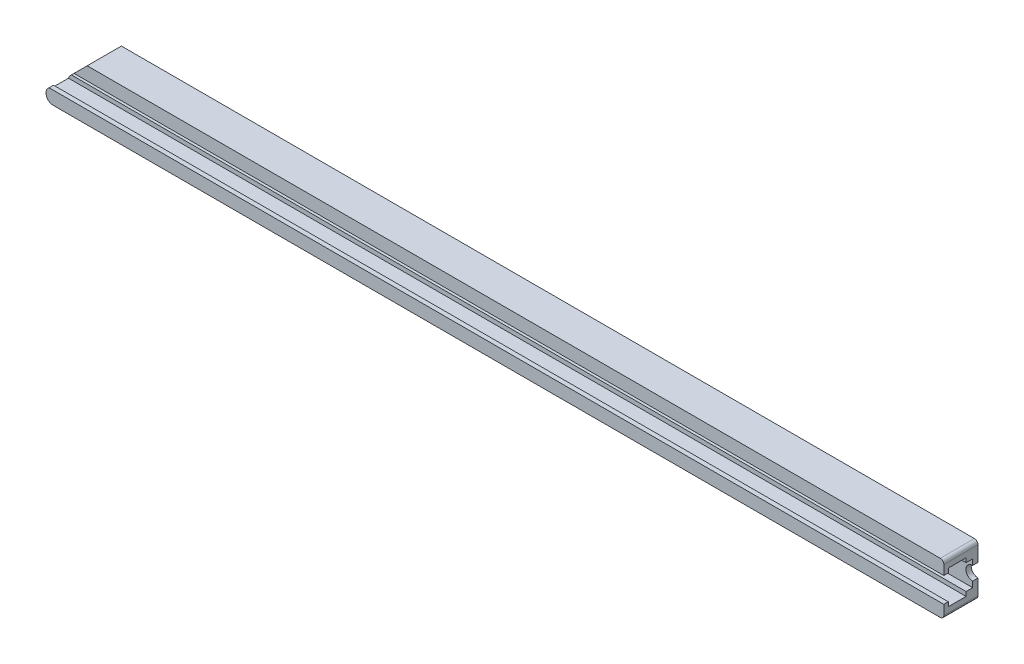
ISO-10303-21;
HEADER;
FILE_DESCRIPTION(('STEP AP214'),'2;1');
FILE_NAME('part.step','',(''),(''),'','','');
FILE_SCHEMA(('AUTOMOTIVE_DESIGN { 1 0 10303 214 1 1 1 1 }'));
ENDSEC;
DATA;
#1=APPLICATION_CONTEXT('core data for automotive mechanical design processes');
#2=APPLICATION_PROTOCOL_DEFINITION('international standard','automotive_design',2000,#1);
#3=PRODUCT_CONTEXT('',#1,'mechanical');
#4=PRODUCT('Part','Part','',(#3));
#5=PRODUCT_RELATED_PRODUCT_CATEGORY('part','',(#4));
#6=PRODUCT_DEFINITION_FORMATION('','',#4);
#7=PRODUCT_DEFINITION_CONTEXT('part definition',#1,'design');
#8=PRODUCT_DEFINITION('design','',#6,#7);
#9=PRODUCT_DEFINITION_SHAPE('','',#8);
#10=(LENGTH_UNIT() NAMED_UNIT(*) SI_UNIT(.MILLI.,.METRE.));
#11=(NAMED_UNIT(*) PLANE_ANGLE_UNIT() SI_UNIT($,.RADIAN.));
#12=(NAMED_UNIT(*) SI_UNIT($,.STERADIAN.) SOLID_ANGLE_UNIT());
#13=UNCERTAINTY_MEASURE_WITH_UNIT(LENGTH_MEASURE(1.E-05),#10,'distance_accuracy_value','');
#14=(GEOMETRIC_REPRESENTATION_CONTEXT(3) GLOBAL_UNCERTAINTY_ASSIGNED_CONTEXT((#13)) GLOBAL_UNIT_ASSIGNED_CONTEXT((#10,
#11,#12)) REPRESENTATION_CONTEXT('',''));
#15=CARTESIAN_POINT('',(0.,0.,0.));
#16=DIRECTION('',(0.,0.,1.));
#17=DIRECTION('',(1.,0.,0.));
#18=AXIS2_PLACEMENT_3D('',#15,#16,#17);
#19=CARTESIAN_POINT('',(-209.55,-9.14400000000005,0.));
#20=DIRECTION('',(0.707106781186551,-0.707106781186544,0.));
#21=DIRECTION('',(0.707106781186544,0.707106781186551,0.));
#22=AXIS2_PLACEMENT_3D('',#19,#20,#21);
#23=PLANE('',#22);
#24=DIRECTION('',(0.707106781186544,0.707106781186551,0.));
#25=VECTOR('',#24,1.);
#26=CARTESIAN_POINT('',(-209.55,-9.14400000000005,0.));
#27=LINE('',#26,#25);
#28=CARTESIAN_POINT('',(-205.213948775786,-4.80794877578618,0.));
#29=VERTEX_POINT('',#28);
#30=CARTESIAN_POINT('',(-191.262,9.144,0.));
#31=VERTEX_POINT('',#30);
#32=EDGE_CURVE('E392',#29,#31,#27,.T.);
#33=ORIENTED_EDGE('',*,*,#32,.F.);
#34=DIRECTION('',(0.,0.,1.));
#35=VECTOR('',#34,1.);
#36=CARTESIAN_POINT('',(-205.213948775786,-4.80794877578618,0.));
#37=LINE('',#36,#35);
#38=CARTESIAN_POINT('',(-205.213948775786,-4.80794877578622,4.2545));
#39=VERTEX_POINT('',#38);
#40=EDGE_CURVE('E292',#29,#39,#37,.T.);
#41=ORIENTED_EDGE('',*,*,#40,.T.);
#42=DIRECTION('',(-0.707106781186544,-0.707106781186551,0.));
#43=VECTOR('',#42,1.);
#44=CARTESIAN_POINT('',(11.8744999999978,212.2805,4.25450000000012));
#45=LINE('',#44,#43);
#46=CARTESIAN_POINT('',(-204.851,-4.445,4.2545));
#47=VERTEX_POINT('',#46);
#48=EDGE_CURVE('E412',#47,#39,#45,.T.);
#49=ORIENTED_EDGE('',*,*,#48,.F.);
#50=DIRECTION('',(0.,0.,1.));
#51=VECTOR('',#50,1.);
#52=CARTESIAN_POINT('',(-204.851,-4.445,1.90499999999968));
#53=LINE('',#52,#51);
#54=CARTESIAN_POINT('',(-204.851,-4.445,1.905));
#55=VERTEX_POINT('',#54);
#56=EDGE_CURVE('E416',#55,#47,#53,.T.);
#57=ORIENTED_EDGE('',*,*,#56,.F.);
#58=DIRECTION('',(-0.707106781186544,-0.707106781186551,0.));
#59=VECTOR('',#58,1.);
#60=CARTESIAN_POINT('',(16.3194999999977,216.7255,1.90500000000003));
#61=LINE('',#60,#59);
#62=CARTESIAN_POINT('',(-195.961,4.44499999999998,1.905));
#63=VERTEX_POINT('',#62);
#64=EDGE_CURVE('E420',#63,#55,#61,.T.);
#65=ORIENTED_EDGE('',*,*,#64,.F.);
#66=DIRECTION('',(0.,0.,-1.));
#67=VECTOR('',#66,1.);
#68=CARTESIAN_POINT('',(-195.961,4.445,4.2545));
#69=LINE('',#68,#67);
#70=CARTESIAN_POINT('',(-195.961,4.445,4.2545));
#71=VERTEX_POINT('',#70);
#72=EDGE_CURVE('E424',#71,#63,#69,.T.);
#73=ORIENTED_EDGE('',*,*,#72,.F.);
#74=DIRECTION('',(-0.707106781186544,-0.707106781186551,0.));
#75=VECTOR('',#74,1.);
#76=CARTESIAN_POINT('',(17.0814999999978,217.4875,4.2545));
#77=LINE('',#76,#75);
#78=CARTESIAN_POINT('',(-194.437,5.96899999999997,4.2545));
#79=VERTEX_POINT('',#78);
#80=EDGE_CURVE('E428',#79,#71,#77,.T.);
#81=ORIENTED_EDGE('',*,*,#80,.F.);
#82=DIRECTION('',(0.,0.,-1.));
#83=VECTOR('',#82,1.);
#84=CARTESIAN_POINT('',(-194.437,5.969,10.6044999999999));
#85=LINE('',#84,#83);
#86=CARTESIAN_POINT('',(-194.437,5.969,10.6045));
#87=VERTEX_POINT('',#86);
#88=EDGE_CURVE('E432',#87,#79,#85,.T.);
#89=ORIENTED_EDGE('',*,*,#88,.F.);
#90=DIRECTION('',(0.707106781186544,0.707106781186551,0.));
#91=VECTOR('',#90,1.);
#92=CARTESIAN_POINT('',(16.3194999999977,216.7255,10.6045));
#93=LINE('',#92,#91);
#94=CARTESIAN_POINT('',(-195.961,4.445,10.6045));
#95=VERTEX_POINT('',#94);
#96=EDGE_CURVE('E436',#95,#87,#93,.T.);
#97=ORIENTED_EDGE('',*,*,#96,.F.);
#98=DIRECTION('',(0.,0.,-1.));
#99=VECTOR('',#98,1.);
#100=CARTESIAN_POINT('',(-195.961,4.445,12.192));
#101=LINE('',#100,#99);
#102=CARTESIAN_POINT('',(-195.961,4.445,12.192));
#103=VERTEX_POINT('',#102);
#104=EDGE_CURVE('E440',#103,#95,#101,.T.);
#105=ORIENTED_EDGE('',*,*,#104,.F.);
#106=DIRECTION('',(0.707106781186544,0.707106781186551,0.));
#107=VECTOR('',#106,1.);
#108=CARTESIAN_POINT('',(-209.55,-9.14400000000005,12.192));
#109=LINE('',#108,#107);
#110=CARTESIAN_POINT('',(-191.262,9.144,12.192));
#111=VERTEX_POINT('',#110);
#112=EDGE_CURVE('E391',#103,#111,#109,.T.);
#113=ORIENTED_EDGE('',*,*,#112,.T.);
#114=DIRECTION('',(0.,0.,1.));
#115=VECTOR('',#114,1.);
#116=CARTESIAN_POINT('',(-191.262,9.144,0.));
#117=LINE('',#116,#115);
#118=EDGE_CURVE('E396',#31,#111,#117,.T.);
#119=ORIENTED_EDGE('',*,*,#118,.F.);
#120=EDGE_LOOP('',(#33,#41,#49,#57,#65,#73,#81,#89,#97,#105,#113,#119));
#121=FACE_BOUND('',#120,.T.);
#122=ADVANCED_FACE('F45',(#121),#23,.F.);
#123=CARTESIAN_POINT('',(228.6,-9.144,0.));
#124=DIRECTION('',(0.,0.,1.));
#125=DIRECTION('',(0.,-1.,0.));
#126=AXIS2_PLACEMENT_3D('',#123,#124,#125);
#127=PLANE('',#126);
#128=DIRECTION('',(0.,-1.,0.));
#129=VECTOR('',#128,1.);
#130=CARTESIAN_POINT('',(114.3,9.144,0.));
#131=LINE('',#130,#129);
#132=CARTESIAN_POINT('',(114.3,-2.413,0.));
#133=VERTEX_POINT('',#132);
#134=CARTESIAN_POINT('',(114.3,-7.874,0.));
#135=VERTEX_POINT('',#134);
#136=EDGE_CURVE('E206',#133,#135,#131,.T.);
#137=ORIENTED_EDGE('',*,*,#136,.T.);
#138=CARTESIAN_POINT('',(113.03,-7.874,0.));
#139=DIRECTION('',(0.,0.,1.));
#140=DIRECTION('',(0.,-1.,0.));
#141=AXIS2_PLACEMENT_3D('',#138,#139,#140);
#142=CIRCLE('',#141,1.27);
#143=CARTESIAN_POINT('',(113.03,-9.144,0.));
#144=VERTEX_POINT('',#143);
#145=EDGE_CURVE('E331',#135,#144,#142,.F.);
#146=ORIENTED_EDGE('',*,*,#145,.T.);
#147=DIRECTION('',(-1.,0.,0.));
#148=VECTOR('',#147,1.);
#149=CARTESIAN_POINT('',(228.6,-9.144,0.));
#150=LINE('',#149,#148);
#151=CARTESIAN_POINT('',(-203.417897551572,-9.144,0.));
#152=VERTEX_POINT('',#151);
#153=EDGE_CURVE('E241',#144,#152,#150,.T.);
#154=ORIENTED_EDGE('',*,*,#153,.T.);
#155=CARTESIAN_POINT('',(-203.417897551572,-6.604,0.));
#156=DIRECTION('',(0.,0.,1.));
#157=DIRECTION('',(0.,-1.,0.));
#158=AXIS2_PLACEMENT_3D('',#155,#156,#157);
#159=CIRCLE('',#158,2.54);
#160=EDGE_CURVE('E217',#152,#29,#159,.F.);
#161=ORIENTED_EDGE('',*,*,#160,.T.);
#162=ORIENTED_EDGE('',*,*,#32,.T.);
#163=DIRECTION('',(-1.,0.,0.));
#164=VECTOR('',#163,1.);
#165=CARTESIAN_POINT('',(228.6,9.144,0.));
#166=LINE('',#165,#164);
#167=CARTESIAN_POINT('',(113.03,9.144,0.));
#168=VERTEX_POINT('',#167);
#169=EDGE_CURVE('E286',#168,#31,#166,.T.);
#170=ORIENTED_EDGE('',*,*,#169,.F.);
#171=CARTESIAN_POINT('',(113.03,7.874,0.));
#172=DIRECTION('',(0.,0.,1.));
#173=DIRECTION('',(0.,-1.,0.));
#174=AXIS2_PLACEMENT_3D('',#171,#172,#173);
#175=CIRCLE('',#174,1.27);
#176=CARTESIAN_POINT('',(114.3,7.874,0.));
#177=VERTEX_POINT('',#176);
#178=EDGE_CURVE('E202',#168,#177,#175,.F.);
#179=ORIENTED_EDGE('',*,*,#178,.T.);
#180=CARTESIAN_POINT('',(114.3,2.413,0.));
#181=VERTEX_POINT('',#180);
#182=EDGE_CURVE('E193',#177,#181,#131,.T.);
#183=ORIENTED_EDGE('',*,*,#182,.T.);
#184=CARTESIAN_POINT('',(114.3,0.,0.));
#185=DIRECTION('',(0.,0.,1.));
#186=DIRECTION('',(0.,-1.,0.));
#187=AXIS2_PLACEMENT_3D('',#184,#185,#186);
#188=CIRCLE('',#187,2.413);
#189=EDGE_CURVE('E199',#133,#181,#188,.F.);
#190=ORIENTED_EDGE('',*,*,#189,.F.);
#191=EDGE_LOOP('',(#137,#146,#154,#161,#162,#170,#179,#183,#190));
#192=FACE_BOUND('',#191,.T.);
#193=CARTESIAN_POINT('',(38.1,0.,0.));
#194=DIRECTION('',(0.,0.,1.));
#195=DIRECTION('',(0.,-1.,0.));
#196=AXIS2_PLACEMENT_3D('',#193,#194,#195);
#197=CIRCLE('',#196,2.413);
#198=CARTESIAN_POINT('',(38.1,-2.413,0.));
#199=VERTEX_POINT('',#198);
#200=EDGE_CURVE('E237',#199,#199,#197,.F.);
#201=ORIENTED_EDGE('',*,*,#200,.F.);
#202=EDGE_LOOP('',(#201));
#203=FACE_BOUND('',#202,.T.);
#204=CARTESIAN_POINT('',(-114.3,0.,0.));
#205=DIRECTION('',(0.,0.,-1.));
#206=DIRECTION('',(0.,-1.,0.));
#207=AXIS2_PLACEMENT_3D('',#204,#205,#206);
#208=CIRCLE('',#207,2.413);
#209=CARTESIAN_POINT('',(-114.3,-2.413,0.));
#210=VERTEX_POINT('',#209);
#211=EDGE_CURVE('E444',#210,#210,#208,.F.);
#212=ORIENTED_EDGE('',*,*,#211,.T.);
#213=EDGE_LOOP('',(#212));
#214=FACE_BOUND('',#213,.T.);
#215=CARTESIAN_POINT('',(-38.1,0.,0.));
#216=DIRECTION('',(0.,0.,-1.));
#217=DIRECTION('',(0.,-1.,0.));
#218=AXIS2_PLACEMENT_3D('',#215,#216,#217);
#219=CIRCLE('',#218,2.413);
#220=CARTESIAN_POINT('',(-38.1,-2.413,0.));
#221=VERTEX_POINT('',#220);
#222=EDGE_CURVE('E456',#221,#221,#219,.F.);
#223=ORIENTED_EDGE('',*,*,#222,.T.);
#224=EDGE_LOOP('',(#223));
#225=FACE_BOUND('',#224,.T.);
#226=CARTESIAN_POINT('',(-190.5,0.,0.));
#227=DIRECTION('',(0.,0.,-1.));
#228=DIRECTION('',(0.,-1.,0.));
#229=AXIS2_PLACEMENT_3D('',#226,#227,#228);
#230=CIRCLE('',#229,2.413);
#231=CARTESIAN_POINT('',(-190.5,-2.413,0.));
#232=VERTEX_POINT('',#231);
#233=EDGE_CURVE('E230',#232,#232,#230,.F.);
#234=ORIENTED_EDGE('',*,*,#233,.T.);
#235=EDGE_LOOP('',(#234));
#236=FACE_BOUND('',#235,.T.);
#237=ADVANCED_FACE('F196',(#192,#203,#214,#225,#236),#127,.F.);
#238=CARTESIAN_POINT('',(228.6,9.144,0.));
#239=DIRECTION('',(0.,-1.,0.));
#240=DIRECTION('',(0.,0.,-1.));
#241=AXIS2_PLACEMENT_3D('',#238,#239,#240);
#242=PLANE('',#241);
#243=DIRECTION('',(-1.,0.,0.));
#244=VECTOR('',#243,1.);
#245=CARTESIAN_POINT('',(228.6,9.144,12.192));
#246=LINE('',#245,#244);
#247=CARTESIAN_POINT('',(113.03,9.144,12.192));
#248=VERTEX_POINT('',#247);
#249=EDGE_CURVE('E283',#248,#111,#246,.T.);
#250=ORIENTED_EDGE('',*,*,#249,.F.);
#251=DIRECTION('',(0.,0.,1.));
#252=VECTOR('',#251,1.);
#253=CARTESIAN_POINT('',(113.03,9.144,0.));
#254=LINE('',#253,#252);
#255=EDGE_CURVE('E12',#248,#168,#254,.F.);
#256=ORIENTED_EDGE('',*,*,#255,.T.);
#257=ORIENTED_EDGE('',*,*,#169,.T.);
#258=ORIENTED_EDGE('',*,*,#118,.T.);
#259=EDGE_LOOP('',(#250,#256,#257,#258));
#260=FACE_BOUND('',#259,.T.);
#261=ADVANCED_FACE('F497',(#260),#242,.F.);
#262=CARTESIAN_POINT('',(228.6,9.144,12.192));
#263=DIRECTION('',(0.,0.,-1.));
#264=DIRECTION('',(0.,1.,0.));
#265=AXIS2_PLACEMENT_3D('',#262,#263,#264);
#266=PLANE('',#265);
#267=DIRECTION('',(0.,-1.,0.));
#268=VECTOR('',#267,1.);
#269=CARTESIAN_POINT('',(114.3,9.144,12.192));
#270=LINE('',#269,#268);
#271=CARTESIAN_POINT('',(114.3,7.874,12.192));
#272=VERTEX_POINT('',#271);
#273=CARTESIAN_POINT('',(114.3,4.445,12.192));
#274=VERTEX_POINT('',#273);
#275=EDGE_CURVE('E337',#272,#274,#270,.T.);
#276=ORIENTED_EDGE('',*,*,#275,.F.);
#277=CARTESIAN_POINT('',(113.03,7.874,12.192));
#278=DIRECTION('',(0.,0.,-1.));
#279=DIRECTION('',(0.,1.,0.));
#280=AXIS2_PLACEMENT_3D('',#277,#278,#279);
#281=CIRCLE('',#280,1.27);
#282=EDGE_CURVE('E54',#272,#248,#281,.F.);
#283=ORIENTED_EDGE('',*,*,#282,.T.);
#284=ORIENTED_EDGE('',*,*,#249,.T.);
#285=ORIENTED_EDGE('',*,*,#112,.F.);
#286=DIRECTION('',(-1.,0.,0.));
#287=VECTOR('',#286,1.);
#288=CARTESIAN_POINT('',(228.6,4.445,12.192));
#289=LINE('',#288,#287);
#290=EDGE_CURVE('E280',#274,#103,#289,.T.);
#291=ORIENTED_EDGE('',*,*,#290,.F.);
#292=EDGE_LOOP('',(#276,#283,#284,#285,#291));
#293=FACE_BOUND('',#292,.T.);
#294=ADVANCED_FACE('F340',(#293),#266,.F.);
#295=CARTESIAN_POINT('',(228.6,4.445,12.192));
#296=DIRECTION('',(0.,1.,0.));
#297=DIRECTION('',(0.,0.,1.));
#298=AXIS2_PLACEMENT_3D('',#295,#296,#297);
#299=PLANE('',#298);
#300=DIRECTION('',(-1.,0.,0.));
#301=VECTOR('',#300,1.);
#302=CARTESIAN_POINT('',(228.6,4.445,10.6045));
#303=LINE('',#302,#301);
#304=CARTESIAN_POINT('',(114.3,4.445,10.6045));
#305=VERTEX_POINT('',#304);
#306=EDGE_CURVE('E277',#305,#95,#303,.T.);
#307=ORIENTED_EDGE('',*,*,#306,.F.);
#308=DIRECTION('',(0.,0.,1.));
#309=VECTOR('',#308,1.);
#310=CARTESIAN_POINT('',(114.3,4.445,12.192));
#311=LINE('',#310,#309);
#312=EDGE_CURVE('E368',#305,#274,#311,.T.);
#313=ORIENTED_EDGE('',*,*,#312,.T.);
#314=ORIENTED_EDGE('',*,*,#290,.T.);
#315=ORIENTED_EDGE('',*,*,#104,.T.);
#316=EDGE_LOOP('',(#307,#313,#314,#315));
#317=FACE_BOUND('',#316,.T.);
#318=ADVANCED_FACE('F557',(#317),#299,.F.);
#319=CARTESIAN_POINT('',(228.6,4.445,10.6045));
#320=DIRECTION('',(0.,0.,1.));
#321=DIRECTION('',(1.,0.,0.));
#322=AXIS2_PLACEMENT_3D('',#319,#320,#321);
#323=PLANE('',#322);
#324=DIRECTION('',(-1.,0.,0.));
#325=VECTOR('',#324,1.);
#326=CARTESIAN_POINT('',(228.6,5.969,10.6045));
#327=LINE('',#326,#325);
#328=CARTESIAN_POINT('',(114.3,5.969,10.6045));
#329=VERTEX_POINT('',#328);
#330=EDGE_CURVE('E274',#329,#87,#327,.T.);
#331=ORIENTED_EDGE('',*,*,#330,.F.);
#332=DIRECTION('',(0.,-1.,0.));
#333=VECTOR('',#332,1.);
#334=CARTESIAN_POINT('',(114.3,4.445,10.6045));
#335=LINE('',#334,#333);
#336=EDGE_CURVE('E364',#329,#305,#335,.T.);
#337=ORIENTED_EDGE('',*,*,#336,.T.);
#338=ORIENTED_EDGE('',*,*,#306,.T.);
#339=ORIENTED_EDGE('',*,*,#96,.T.);
#340=EDGE_LOOP('',(#331,#337,#338,#339));
#341=FACE_BOUND('',#340,.T.);
#342=ADVANCED_FACE('F554',(#341),#323,.F.);
#343=CARTESIAN_POINT('',(228.6,5.969,10.6045));
#344=DIRECTION('',(0.,1.,0.));
#345=DIRECTION('',(0.,0.,1.));
#346=AXIS2_PLACEMENT_3D('',#343,#344,#345);
#347=PLANE('',#346);
#348=DIRECTION('',(-1.,0.,0.));
#349=VECTOR('',#348,1.);
#350=CARTESIAN_POINT('',(228.6,5.969,4.2545));
#351=LINE('',#350,#349);
#352=CARTESIAN_POINT('',(114.3,5.969,4.2545));
#353=VERTEX_POINT('',#352);
#354=EDGE_CURVE('E271',#353,#79,#351,.T.);
#355=ORIENTED_EDGE('',*,*,#354,.F.);
#356=DIRECTION('',(0.,0.,1.));
#357=VECTOR('',#356,1.);
#358=CARTESIAN_POINT('',(114.3,5.969,10.6045));
#359=LINE('',#358,#357);
#360=EDGE_CURVE('E360',#353,#329,#359,.T.);
#361=ORIENTED_EDGE('',*,*,#360,.T.);
#362=ORIENTED_EDGE('',*,*,#330,.T.);
#363=ORIENTED_EDGE('',*,*,#88,.T.);
#364=EDGE_LOOP('',(#355,#361,#362,#363));
#365=FACE_BOUND('',#364,.T.);
#366=ADVANCED_FACE('F549',(#365),#347,.F.);
#367=CARTESIAN_POINT('',(228.6,5.969,4.2545));
#368=DIRECTION('',(0.,0.,-1.));
#369=DIRECTION('',(-1.,0.,0.));
#370=AXIS2_PLACEMENT_3D('',#367,#368,#369);
#371=PLANE('',#370);
#372=DIRECTION('',(-1.,0.,0.));
#373=VECTOR('',#372,1.);
#374=CARTESIAN_POINT('',(228.6,4.445,4.2545));
#375=LINE('',#374,#373);
#376=CARTESIAN_POINT('',(114.3,4.445,4.2545));
#377=VERTEX_POINT('',#376);
#378=EDGE_CURVE('E268',#377,#71,#375,.T.);
#379=ORIENTED_EDGE('',*,*,#378,.F.);
#380=DIRECTION('',(0.,1.,0.));
#381=VECTOR('',#380,1.);
#382=CARTESIAN_POINT('',(114.3,5.969,4.2545));
#383=LINE('',#382,#381);
#384=EDGE_CURVE('E356',#377,#353,#383,.T.);
#385=ORIENTED_EDGE('',*,*,#384,.T.);
#386=ORIENTED_EDGE('',*,*,#354,.T.);
#387=ORIENTED_EDGE('',*,*,#80,.T.);
#388=EDGE_LOOP('',(#379,#385,#386,#387));
#389=FACE_BOUND('',#388,.T.);
#390=ADVANCED_FACE('F485',(#389),#371,.F.);
#391=CARTESIAN_POINT('',(228.6,4.445,4.2545));
#392=DIRECTION('',(0.,1.,0.));
#393=DIRECTION('',(0.,0.,1.));
#394=AXIS2_PLACEMENT_3D('',#391,#392,#393);
#395=PLANE('',#394);
#396=DIRECTION('',(-1.,0.,0.));
#397=VECTOR('',#396,1.);
#398=CARTESIAN_POINT('',(228.6,4.445,1.905));
#399=LINE('',#398,#397);
#400=CARTESIAN_POINT('',(114.3,4.445,1.905));
#401=VERTEX_POINT('',#400);
#402=EDGE_CURVE('E265',#401,#63,#399,.T.);
#403=ORIENTED_EDGE('',*,*,#402,.F.);
#404=DIRECTION('',(0.,0.,1.));
#405=VECTOR('',#404,1.);
#406=CARTESIAN_POINT('',(114.3,4.445,4.2545));
#407=LINE('',#406,#405);
#408=EDGE_CURVE('E351',#401,#377,#407,.T.);
#409=ORIENTED_EDGE('',*,*,#408,.T.);
#410=ORIENTED_EDGE('',*,*,#378,.T.);
#411=ORIENTED_EDGE('',*,*,#72,.T.);
#412=EDGE_LOOP('',(#403,#409,#410,#411));
#413=FACE_BOUND('',#412,.T.);
#414=ADVANCED_FACE('F475',(#413),#395,.F.);
#415=CARTESIAN_POINT('',(228.6,4.445,1.905));
#416=DIRECTION('',(0.,0.,-1.));
#417=DIRECTION('',(0.,1.,0.));
#418=AXIS2_PLACEMENT_3D('',#415,#416,#417);
#419=PLANE('',#418);
#420=DIRECTION('',(-1.,0.,0.));
#421=VECTOR('',#420,1.);
#422=CARTESIAN_POINT('',(228.6,-4.445,1.905));
#423=LINE('',#422,#421);
#424=CARTESIAN_POINT('',(114.3,-4.445,1.905));
#425=VERTEX_POINT('',#424);
#426=EDGE_CURVE('E262',#425,#55,#423,.T.);
#427=ORIENTED_EDGE('',*,*,#426,.F.);
#428=DIRECTION('',(0.,1.,0.));
#429=VECTOR('',#428,1.);
#430=CARTESIAN_POINT('',(114.3,4.445,1.905));
#431=LINE('',#430,#429);
#432=CARTESIAN_POINT('',(114.3,-2.413,1.905));
#433=VERTEX_POINT('',#432);
#434=EDGE_CURVE('E352',#425,#433,#431,.T.);
#435=ORIENTED_EDGE('',*,*,#434,.T.);
#436=CARTESIAN_POINT('',(114.3,0.,1.905));
#437=DIRECTION('',(0.,0.,1.));
#438=DIRECTION('',(1.,0.,0.));
#439=AXIS2_PLACEMENT_3D('',#436,#437,#438);
#440=CIRCLE('',#439,2.413);
#441=CARTESIAN_POINT('',(114.3,2.413,1.905));
#442=VERTEX_POINT('',#441);
#443=EDGE_CURVE('E222',#442,#433,#440,.T.);
#444=ORIENTED_EDGE('',*,*,#443,.F.);
#445=EDGE_CURVE('E205',#442,#401,#431,.T.);
#446=ORIENTED_EDGE('',*,*,#445,.T.);
#447=ORIENTED_EDGE('',*,*,#402,.T.);
#448=ORIENTED_EDGE('',*,*,#64,.T.);
#449=EDGE_LOOP('',(#427,#435,#444,#446,#447,#448));
#450=FACE_BOUND('',#449,.T.);
#451=CARTESIAN_POINT('',(38.1,0.,1.905));
#452=DIRECTION('',(0.,0.,1.));
#453=DIRECTION('',(1.,0.,0.));
#454=AXIS2_PLACEMENT_3D('',#451,#452,#453);
#455=CIRCLE('',#454,2.413);
#456=CARTESIAN_POINT('',(40.513,0.,1.905));
#457=VERTEX_POINT('',#456);
#458=EDGE_CURVE('E227',#457,#457,#455,.T.);
#459=ORIENTED_EDGE('',*,*,#458,.F.);
#460=EDGE_LOOP('',(#459));
#461=FACE_BOUND('',#460,.T.);
#462=CARTESIAN_POINT('',(-114.3,0.,1.905));
#463=DIRECTION('',(0.,0.,-1.));
#464=DIRECTION('',(-1.,0.,0.));
#465=AXIS2_PLACEMENT_3D('',#462,#463,#464);
#466=CIRCLE('',#465,2.413);
#467=CARTESIAN_POINT('',(-116.713,0.,1.905));
#468=VERTEX_POINT('',#467);
#469=EDGE_CURVE('E448',#468,#468,#466,.T.);
#470=ORIENTED_EDGE('',*,*,#469,.T.);
#471=EDGE_LOOP('',(#470));
#472=FACE_BOUND('',#471,.T.);
#473=CARTESIAN_POINT('',(-38.1,0.,1.905));
#474=DIRECTION('',(0.,0.,-1.));
#475=DIRECTION('',(-1.,0.,0.));
#476=AXIS2_PLACEMENT_3D('',#473,#474,#475);
#477=CIRCLE('',#476,2.413);
#478=CARTESIAN_POINT('',(-40.513,0.,1.905));
#479=VERTEX_POINT('',#478);
#480=EDGE_CURVE('E452',#479,#479,#477,.T.);
#481=ORIENTED_EDGE('',*,*,#480,.T.);
#482=EDGE_LOOP('',(#481));
#483=FACE_BOUND('',#482,.T.);
#484=CARTESIAN_POINT('',(-190.5,0.,1.905));
#485=DIRECTION('',(0.,0.,-1.));
#486=DIRECTION('',(-1.,0.,0.));
#487=AXIS2_PLACEMENT_3D('',#484,#485,#486);
#488=CIRCLE('',#487,2.413);
#489=CARTESIAN_POINT('',(-192.913,0.,1.905));
#490=VERTEX_POINT('',#489);
#491=EDGE_CURVE('E223',#490,#490,#488,.T.);
#492=ORIENTED_EDGE('',*,*,#491,.T.);
#493=EDGE_LOOP('',(#492));
#494=FACE_BOUND('',#493,.T.);
#495=ADVANCED_FACE('F472',(#450,#461,#472,#483,#494),#419,.F.);
#496=CARTESIAN_POINT('',(228.6,-4.445,1.905));
#497=DIRECTION('',(0.,-1.,0.));
#498=DIRECTION('',(0.,0.,-1.));
#499=AXIS2_PLACEMENT_3D('',#496,#497,#498);
#500=PLANE('',#499);
#501=DIRECTION('',(-1.,0.,0.));
#502=VECTOR('',#501,1.);
#503=CARTESIAN_POINT('',(228.6,-4.445,4.2545));
#504=LINE('',#503,#502);
#505=CARTESIAN_POINT('',(114.3,-4.445,4.2545));
#506=VERTEX_POINT('',#505);
#507=EDGE_CURVE('E259',#506,#47,#504,.T.);
#508=ORIENTED_EDGE('',*,*,#507,.F.);
#509=DIRECTION('',(0.,0.,-1.));
#510=VECTOR('',#509,1.);
#511=CARTESIAN_POINT('',(114.3,-4.445,1.905));
#512=LINE('',#511,#510);
#513=EDGE_CURVE('E371',#506,#425,#512,.T.);
#514=ORIENTED_EDGE('',*,*,#513,.T.);
#515=ORIENTED_EDGE('',*,*,#426,.T.);
#516=ORIENTED_EDGE('',*,*,#56,.T.);
#517=EDGE_LOOP('',(#508,#514,#515,#516));
#518=FACE_BOUND('',#517,.T.);
#519=ADVANCED_FACE('F474',(#518),#500,.F.);
#520=CARTESIAN_POINT('',(228.6,-4.445,4.2545));
#521=DIRECTION('',(0.,0.,-1.));
#522=DIRECTION('',(0.,1.,0.));
#523=AXIS2_PLACEMENT_3D('',#520,#521,#522);
#524=PLANE('',#523);
#525=DIRECTION('',(-1.,0.,0.));
#526=VECTOR('',#525,1.);
#527=CARTESIAN_POINT('',(228.6,-5.969,4.2545));
#528=LINE('',#527,#526);
#529=CARTESIAN_POINT('',(114.3,-5.969,4.2545));
#530=VERTEX_POINT('',#529);
#531=CARTESIAN_POINT('',(-205.877241976414,-5.969,4.2545));
#532=VERTEX_POINT('',#531);
#533=EDGE_CURVE('E256',#530,#532,#528,.T.);
#534=ORIENTED_EDGE('',*,*,#533,.F.);
#535=DIRECTION('',(0.,1.,0.));
#536=VECTOR('',#535,1.);
#537=CARTESIAN_POINT('',(114.3,-4.445,4.2545));
#538=LINE('',#537,#536);
#539=EDGE_CURVE('E375',#530,#506,#538,.T.);
#540=ORIENTED_EDGE('',*,*,#539,.T.);
#541=ORIENTED_EDGE('',*,*,#507,.T.);
#542=ORIENTED_EDGE('',*,*,#48,.T.);
#543=CARTESIAN_POINT('',(-203.417897551572,-6.604,4.2545));
#544=DIRECTION('',(0.,0.,-1.));
#545=DIRECTION('',(0.,1.,0.));
#546=AXIS2_PLACEMENT_3D('',#543,#544,#545);
#547=CIRCLE('',#546,2.54);
#548=EDGE_CURVE('E296',#39,#532,#547,.F.);
#549=ORIENTED_EDGE('',*,*,#548,.T.);
#550=EDGE_LOOP('',(#534,#540,#541,#542,#549));
#551=FACE_BOUND('',#550,.T.);
#552=ADVANCED_FACE('F482',(#551),#524,.F.);
#553=CARTESIAN_POINT('',(228.6,-5.969,4.2545));
#554=DIRECTION('',(0.,-1.,0.));
#555=DIRECTION('',(0.,0.,-1.));
#556=AXIS2_PLACEMENT_3D('',#553,#554,#555);
#557=PLANE('',#556);
#558=DIRECTION('',(-1.,0.,0.));
#559=VECTOR('',#558,1.);
#560=CARTESIAN_POINT('',(228.6,-5.969,10.6045));
#561=LINE('',#560,#559);
#562=CARTESIAN_POINT('',(114.3,-5.969,10.6045));
#563=VERTEX_POINT('',#562);
#564=CARTESIAN_POINT('',(-205.877241976414,-5.969,10.6045));
#565=VERTEX_POINT('',#564);
#566=EDGE_CURVE('E253',#563,#565,#561,.T.);
#567=ORIENTED_EDGE('',*,*,#566,.F.);
#568=DIRECTION('',(0.,0.,-1.));
#569=VECTOR('',#568,1.);
#570=CARTESIAN_POINT('',(114.3,-5.969,4.2545));
#571=LINE('',#570,#569);
#572=EDGE_CURVE('E379',#563,#530,#571,.T.);
#573=ORIENTED_EDGE('',*,*,#572,.T.);
#574=ORIENTED_EDGE('',*,*,#533,.T.);
#575=DIRECTION('',(0.,0.,1.));
#576=VECTOR('',#575,1.);
#577=CARTESIAN_POINT('',(-205.877241976414,-5.969,4.2545));
#578=LINE('',#577,#576);
#579=EDGE_CURVE('E300',#532,#565,#578,.T.);
#580=ORIENTED_EDGE('',*,*,#579,.T.);
#581=EDGE_LOOP('',(#567,#573,#574,#580));
#582=FACE_BOUND('',#581,.T.);
#583=ADVANCED_FACE('F531',(#582),#557,.F.);
#584=CARTESIAN_POINT('',(228.6,-5.969,10.6045));
#585=DIRECTION('',(0.,0.,1.));
#586=DIRECTION('',(1.,0.,0.));
#587=AXIS2_PLACEMENT_3D('',#584,#585,#586);
#588=PLANE('',#587);
#589=DIRECTION('',(-1.,0.,0.));
#590=VECTOR('',#589,1.);
#591=CARTESIAN_POINT('',(228.6,-4.445,10.6045));
#592=LINE('',#591,#590);
#593=CARTESIAN_POINT('',(114.3,-4.445,10.6045));
#594=VERTEX_POINT('',#593);
#595=CARTESIAN_POINT('',(-204.851,-4.445,10.6045));
#596=VERTEX_POINT('',#595);
#597=EDGE_CURVE('E250',#594,#596,#592,.T.);
#598=ORIENTED_EDGE('',*,*,#597,.F.);
#599=DIRECTION('',(0.,-1.,0.));
#600=VECTOR('',#599,1.);
#601=CARTESIAN_POINT('',(114.3,-5.969,10.6045));
#602=LINE('',#601,#600);
#603=EDGE_CURVE('E383',#594,#563,#602,.T.);
#604=ORIENTED_EDGE('',*,*,#603,.T.);
#605=ORIENTED_EDGE('',*,*,#566,.T.);
#606=CARTESIAN_POINT('',(-203.417897551572,-6.604,10.6045));
#607=DIRECTION('',(0.,0.,1.));
#608=DIRECTION('',(1.,0.,0.));
#609=AXIS2_PLACEMENT_3D('',#606,#607,#608);
#610=CIRCLE('',#609,2.54);
#611=CARTESIAN_POINT('',(-205.213948775786,-4.80794877578622,10.6045));
#612=VERTEX_POINT('',#611);
#613=EDGE_CURVE('E304',#565,#612,#610,.F.);
#614=ORIENTED_EDGE('',*,*,#613,.T.);
#615=DIRECTION('',(0.707106781186544,0.707106781186551,0.));
#616=VECTOR('',#615,1.);
#617=CARTESIAN_POINT('',(11.1124999999977,211.5185,10.6045));
#618=LINE('',#617,#616);
#619=EDGE_CURVE('E408',#612,#596,#618,.T.);
#620=ORIENTED_EDGE('',*,*,#619,.T.);
#621=EDGE_LOOP('',(#598,#604,#605,#614,#620));
#622=FACE_BOUND('',#621,.T.);
#623=ADVANCED_FACE('F527',(#622),#588,.F.);
#624=CARTESIAN_POINT('',(228.6,-4.445,10.6045));
#625=DIRECTION('',(0.,-1.,0.));
#626=DIRECTION('',(0.,0.,-1.));
#627=AXIS2_PLACEMENT_3D('',#624,#625,#626);
#628=PLANE('',#627);
#629=DIRECTION('',(-1.,0.,0.));
#630=VECTOR('',#629,1.);
#631=CARTESIAN_POINT('',(228.6,-4.445,12.192));
#632=LINE('',#631,#630);
#633=CARTESIAN_POINT('',(114.3,-4.445,12.192));
#634=VERTEX_POINT('',#633);
#635=CARTESIAN_POINT('',(-204.851,-4.44500000000004,12.192));
#636=VERTEX_POINT('',#635);
#637=EDGE_CURVE('E247',#634,#636,#632,.T.);
#638=ORIENTED_EDGE('',*,*,#637,.F.);
#639=DIRECTION('',(0.,0.,-1.));
#640=VECTOR('',#639,1.);
#641=CARTESIAN_POINT('',(114.3,-4.445,10.6045));
#642=LINE('',#641,#640);
#643=EDGE_CURVE('E387',#634,#594,#642,.T.);
#644=ORIENTED_EDGE('',*,*,#643,.T.);
#645=ORIENTED_EDGE('',*,*,#597,.T.);
#646=DIRECTION('',(0.,0.,1.));
#647=VECTOR('',#646,1.);
#648=CARTESIAN_POINT('',(-204.851,-4.445,10.6044999999995));
#649=LINE('',#648,#647);
#650=EDGE_CURVE('E404',#596,#636,#649,.T.);
#651=ORIENTED_EDGE('',*,*,#650,.T.);
#652=EDGE_LOOP('',(#638,#644,#645,#651));
#653=FACE_BOUND('',#652,.T.);
#654=ADVANCED_FACE('F526',(#653),#628,.F.);
#655=CARTESIAN_POINT('',(228.6,-4.445,12.192));
#656=DIRECTION('',(0.,0.,-1.));
#657=DIRECTION('',(0.,1.,0.));
#658=AXIS2_PLACEMENT_3D('',#655,#656,#657);
#659=PLANE('',#658);
#660=DIRECTION('',(-1.,0.,0.));
#661=VECTOR('',#660,1.);
#662=CARTESIAN_POINT('',(228.6,-9.14400000000001,12.192));
#663=LINE('',#662,#661);
#664=CARTESIAN_POINT('',(113.03,-9.14400000000001,12.192));
#665=VERTEX_POINT('',#664);
#666=CARTESIAN_POINT('',(-203.417897551572,-9.14400000000001,12.192));
#667=VERTEX_POINT('',#666);
#668=EDGE_CURVE('E244',#665,#667,#663,.T.);
#669=ORIENTED_EDGE('',*,*,#668,.F.);
#670=CARTESIAN_POINT('',(113.03,-7.87400000000001,12.192));
#671=DIRECTION('',(0.,0.,-1.));
#672=DIRECTION('',(0.,1.,0.));
#673=AXIS2_PLACEMENT_3D('',#670,#671,#672);
#674=CIRCLE('',#673,1.27);
#675=CARTESIAN_POINT('',(114.3,-7.87400000000001,12.192));
#676=VERTEX_POINT('',#675);
#677=EDGE_CURVE('E323',#665,#676,#674,.F.);
#678=ORIENTED_EDGE('',*,*,#677,.T.);
#679=EDGE_CURVE('E343',#634,#676,#270,.T.);
#680=ORIENTED_EDGE('',*,*,#679,.F.);
#681=ORIENTED_EDGE('',*,*,#637,.T.);
#682=CARTESIAN_POINT('',(-205.213948775786,-4.80794877578619,12.192));
#683=VERTEX_POINT('',#682);
#684=EDGE_CURVE('E397',#683,#636,#109,.T.);
#685=ORIENTED_EDGE('',*,*,#684,.F.);
#686=CARTESIAN_POINT('',(-203.417897551572,-6.60400000000001,12.192));
#687=DIRECTION('',(0.,0.,-1.));
#688=DIRECTION('',(0.,1.,0.));
#689=AXIS2_PLACEMENT_3D('',#686,#687,#688);
#690=CIRCLE('',#689,2.54);
#691=EDGE_CURVE('E307',#683,#667,#690,.F.);
#692=ORIENTED_EDGE('',*,*,#691,.T.);
#693=EDGE_LOOP('',(#669,#678,#680,#681,#685,#692));
#694=FACE_BOUND('',#693,.T.);
#695=ADVANCED_FACE('F522',(#694),#659,.F.);
#696=CARTESIAN_POINT('',(228.6,-9.14400000000001,12.192));
#697=DIRECTION('',(0.,1.,0.));
#698=DIRECTION('',(0.,0.,1.));
#699=AXIS2_PLACEMENT_3D('',#696,#697,#698);
#700=PLANE('',#699);
#701=ORIENTED_EDGE('',*,*,#153,.F.);
#702=DIRECTION('',(0.,0.,1.));
#703=VECTOR('',#702,1.);
#704=CARTESIAN_POINT('',(113.03,-9.14400000000001,12.192));
#705=LINE('',#704,#703);
#706=EDGE_CURVE('E319',#144,#665,#705,.T.);
#707=ORIENTED_EDGE('',*,*,#706,.T.);
#708=ORIENTED_EDGE('',*,*,#668,.T.);
#709=DIRECTION('',(0.,0.,1.));
#710=VECTOR('',#709,1.);
#711=CARTESIAN_POINT('',(-203.417897551572,-9.14400000000001,12.1919999999997));
#712=LINE('',#711,#710);
#713=EDGE_CURVE('E311',#667,#152,#712,.F.);
#714=ORIENTED_EDGE('',*,*,#713,.T.);
#715=EDGE_LOOP('',(#701,#707,#708,#714));
#716=FACE_BOUND('',#715,.T.);
#717=ADVANCED_FACE('F569',(#716),#700,.F.);
#718=CARTESIAN_POINT('',(38.1,0.,-6.82499465201257));
#719=DIRECTION('',(0.,0.,1.));
#720=DIRECTION('',(1.,0.,0.));
#721=AXIS2_PLACEMENT_3D('',#718,#719,#720);
#722=CYLINDRICAL_SURFACE('',#721,2.413);
#723=ORIENTED_EDGE('',*,*,#200,.T.);
#724=EDGE_LOOP('',(#723));
#725=FACE_BOUND('',#724,.T.);
#726=ORIENTED_EDGE('',*,*,#458,.T.);
#727=EDGE_LOOP('',(#726));
#728=FACE_BOUND('',#727,.T.);
#729=ADVANCED_FACE('F670',(#725,#728),#722,.F.);
#730=CARTESIAN_POINT('',(114.3,0.,-6.82499465201257));
#731=DIRECTION('',(0.,0.,1.));
#732=DIRECTION('',(1.,0.,0.));
#733=AXIS2_PLACEMENT_3D('',#730,#731,#732);
#734=CYLINDRICAL_SURFACE('',#733,2.413);
#735=ORIENTED_EDGE('',*,*,#443,.T.);
#736=DIRECTION('',(0.,0.,1.));
#737=VECTOR('',#736,1.);
#738=CARTESIAN_POINT('',(114.3,-2.413,-6.82499465201257));
#739=LINE('',#738,#737);
#740=EDGE_CURVE('E216',#433,#133,#739,.F.);
#741=ORIENTED_EDGE('',*,*,#740,.T.);
#742=ORIENTED_EDGE('',*,*,#189,.T.);
#743=DIRECTION('',(0.,0.,1.));
#744=VECTOR('',#743,1.);
#745=CARTESIAN_POINT('',(114.3,2.413,-6.82499465201257));
#746=LINE('',#745,#744);
#747=EDGE_CURVE('E209',#181,#442,#746,.T.);
#748=ORIENTED_EDGE('',*,*,#747,.T.);
#749=EDGE_LOOP('',(#735,#741,#742,#748));
#750=FACE_BOUND('',#749,.T.);
#751=ADVANCED_FACE('F220',(#750),#734,.F.);
#752=CARTESIAN_POINT('',(-38.1,0.,-6.82499465201257));
#753=DIRECTION('',(0.,0.,1.));
#754=DIRECTION('',(-1.,0.,0.));
#755=AXIS2_PLACEMENT_3D('',#752,#753,#754);
#756=CYLINDRICAL_SURFACE('',#755,2.413);
#757=ORIENTED_EDGE('',*,*,#222,.F.);
#758=EDGE_LOOP('',(#757));
#759=FACE_BOUND('',#758,.T.);
#760=ORIENTED_EDGE('',*,*,#480,.F.);
#761=EDGE_LOOP('',(#760));
#762=FACE_BOUND('',#761,.T.);
#763=ADVANCED_FACE('F677',(#759,#762),#756,.F.);
#764=CARTESIAN_POINT('',(-114.3,0.,-6.82499465201257));
#765=DIRECTION('',(0.,0.,1.));
#766=DIRECTION('',(-1.,0.,0.));
#767=AXIS2_PLACEMENT_3D('',#764,#765,#766);
#768=CYLINDRICAL_SURFACE('',#767,2.413);
#769=ORIENTED_EDGE('',*,*,#211,.F.);
#770=EDGE_LOOP('',(#769));
#771=FACE_BOUND('',#770,.T.);
#772=ORIENTED_EDGE('',*,*,#469,.F.);
#773=EDGE_LOOP('',(#772));
#774=FACE_BOUND('',#773,.T.);
#775=ADVANCED_FACE('F468',(#771,#774),#768,.F.);
#776=CARTESIAN_POINT('',(-190.5,0.,-6.82499465201257));
#777=DIRECTION('',(0.,0.,1.));
#778=DIRECTION('',(-1.,0.,0.));
#779=AXIS2_PLACEMENT_3D('',#776,#777,#778);
#780=CYLINDRICAL_SURFACE('',#779,2.413);
#781=ORIENTED_EDGE('',*,*,#233,.F.);
#782=EDGE_LOOP('',(#781));
#783=FACE_BOUND('',#782,.T.);
#784=ORIENTED_EDGE('',*,*,#491,.F.);
#785=EDGE_LOOP('',(#784));
#786=FACE_BOUND('',#785,.T.);
#787=ADVANCED_FACE('F464',(#783,#786),#780,.F.);
#788=ORIENTED_EDGE('',*,*,#619,.F.);
#789=DIRECTION('',(0.,0.,1.));
#790=VECTOR('',#789,1.);
#791=CARTESIAN_POINT('',(-205.213948775786,-4.80794877578618,0.));
#792=LINE('',#791,#790);
#793=EDGE_CURVE('E289',#612,#683,#792,.T.);
#794=ORIENTED_EDGE('',*,*,#793,.T.);
#795=ORIENTED_EDGE('',*,*,#684,.T.);
#796=ORIENTED_EDGE('',*,*,#650,.F.);
#797=EDGE_LOOP('',(#788,#794,#795,#796));
#798=FACE_BOUND('',#797,.T.);
#799=ADVANCED_FACE('F467',(#798),#23,.F.);
#800=CARTESIAN_POINT('',(-203.417897551572,-6.604,0.));
#801=DIRECTION('',(0.,0.,1.));
#802=DIRECTION('',(0.,-1.,0.));
#803=AXIS2_PLACEMENT_3D('',#800,#801,#802);
#804=CYLINDRICAL_SURFACE('',#803,2.54);
#805=ORIENTED_EDGE('',*,*,#160,.F.);
#806=ORIENTED_EDGE('',*,*,#713,.F.);
#807=ORIENTED_EDGE('',*,*,#691,.F.);
#808=ORIENTED_EDGE('',*,*,#793,.F.);
#809=ORIENTED_EDGE('',*,*,#613,.F.);
#810=ORIENTED_EDGE('',*,*,#579,.F.);
#811=ORIENTED_EDGE('',*,*,#548,.F.);
#812=ORIENTED_EDGE('',*,*,#40,.F.);
#813=EDGE_LOOP('',(#805,#806,#807,#808,#809,#810,#811,#812));
#814=FACE_BOUND('',#813,.T.);
#815=ADVANCED_FACE('F502',(#814),#804,.T.);
#816=CARTESIAN_POINT('',(114.3,9.144,0.));
#817=DIRECTION('',(-1.,0.,0.));
#818=DIRECTION('',(0.,0.,1.));
#819=AXIS2_PLACEMENT_3D('',#816,#817,#818);
#820=PLANE('',#819);
#821=ORIENTED_EDGE('',*,*,#182,.F.);
#822=DIRECTION('',(0.,0.,1.));
#823=VECTOR('',#822,1.);
#824=CARTESIAN_POINT('',(114.3,7.874,0.));
#825=LINE('',#824,#823);
#826=EDGE_CURVE('E334',#177,#272,#825,.T.);
#827=ORIENTED_EDGE('',*,*,#826,.T.);
#828=ORIENTED_EDGE('',*,*,#275,.T.);
#829=ORIENTED_EDGE('',*,*,#312,.F.);
#830=ORIENTED_EDGE('',*,*,#336,.F.);
#831=ORIENTED_EDGE('',*,*,#360,.F.);
#832=ORIENTED_EDGE('',*,*,#384,.F.);
#833=ORIENTED_EDGE('',*,*,#408,.F.);
#834=ORIENTED_EDGE('',*,*,#445,.F.);
#835=ORIENTED_EDGE('',*,*,#747,.F.);
#836=EDGE_LOOP('',(#821,#827,#828,#829,#830,#831,#832,#833,#834,#835));
#837=FACE_BOUND('',#836,.T.);
#838=ADVANCED_FACE('F210',(#837),#820,.F.);
#839=ORIENTED_EDGE('',*,*,#679,.T.);
#840=DIRECTION('',(0.,0.,1.));
#841=VECTOR('',#840,1.);
#842=CARTESIAN_POINT('',(114.3,-7.874,0.));
#843=LINE('',#842,#841);
#844=EDGE_CURVE('E326',#676,#135,#843,.F.);
#845=ORIENTED_EDGE('',*,*,#844,.T.);
#846=ORIENTED_EDGE('',*,*,#136,.F.);
#847=ORIENTED_EDGE('',*,*,#740,.F.);
#848=ORIENTED_EDGE('',*,*,#434,.F.);
#849=ORIENTED_EDGE('',*,*,#513,.F.);
#850=ORIENTED_EDGE('',*,*,#539,.F.);
#851=ORIENTED_EDGE('',*,*,#572,.F.);
#852=ORIENTED_EDGE('',*,*,#603,.F.);
#853=ORIENTED_EDGE('',*,*,#643,.F.);
#854=EDGE_LOOP('',(#839,#845,#846,#847,#848,#849,#850,#851,#852,#853));
#855=FACE_BOUND('',#854,.T.);
#856=ADVANCED_FACE('F561',(#855),#820,.F.);
#857=CARTESIAN_POINT('',(113.03,-7.87400000000001,12.192));
#858=DIRECTION('',(0.,0.,1.));
#859=DIRECTION('',(0.,-1.,0.));
#860=AXIS2_PLACEMENT_3D('',#857,#858,#859);
#861=CYLINDRICAL_SURFACE('',#860,1.27);
#862=ORIENTED_EDGE('',*,*,#145,.F.);
#863=ORIENTED_EDGE('',*,*,#844,.F.);
#864=ORIENTED_EDGE('',*,*,#677,.F.);
#865=ORIENTED_EDGE('',*,*,#706,.F.);
#866=EDGE_LOOP('',(#862,#863,#864,#865));
#867=FACE_BOUND('',#866,.T.);
#868=ADVANCED_FACE('F567',(#867),#861,.T.);
#869=CARTESIAN_POINT('',(113.03,7.874,0.));
#870=DIRECTION('',(0.,0.,1.));
#871=DIRECTION('',(1.,0.,0.));
#872=AXIS2_PLACEMENT_3D('',#869,#870,#871);
#873=CYLINDRICAL_SURFACE('',#872,1.27);
#874=ORIENTED_EDGE('',*,*,#178,.F.);
#875=ORIENTED_EDGE('',*,*,#255,.F.);
#876=ORIENTED_EDGE('',*,*,#282,.F.);
#877=ORIENTED_EDGE('',*,*,#826,.F.);
#878=EDGE_LOOP('',(#874,#875,#876,#877));
#879=FACE_BOUND('',#878,.T.);
#880=ADVANCED_FACE('F47',(#879),#873,.T.);
#881=CLOSED_SHELL('',(#122,#237,#261,#294,#318,#342,#366,#390,#414,#495,#519,#552,#583,#623,
#654,#695,#717,#729,#751,#763,#775,#787,#799,#815,#838,#856,#868,#880));
#882=MANIFOLD_SOLID_BREP('B2',#881);
#883=ADVANCED_BREP_SHAPE_REPRESENTATION('',(#18,#882),#14);
#884=SHAPE_DEFINITION_REPRESENTATION(#9,#883);
ENDSEC;
END-ISO-10303-21;
